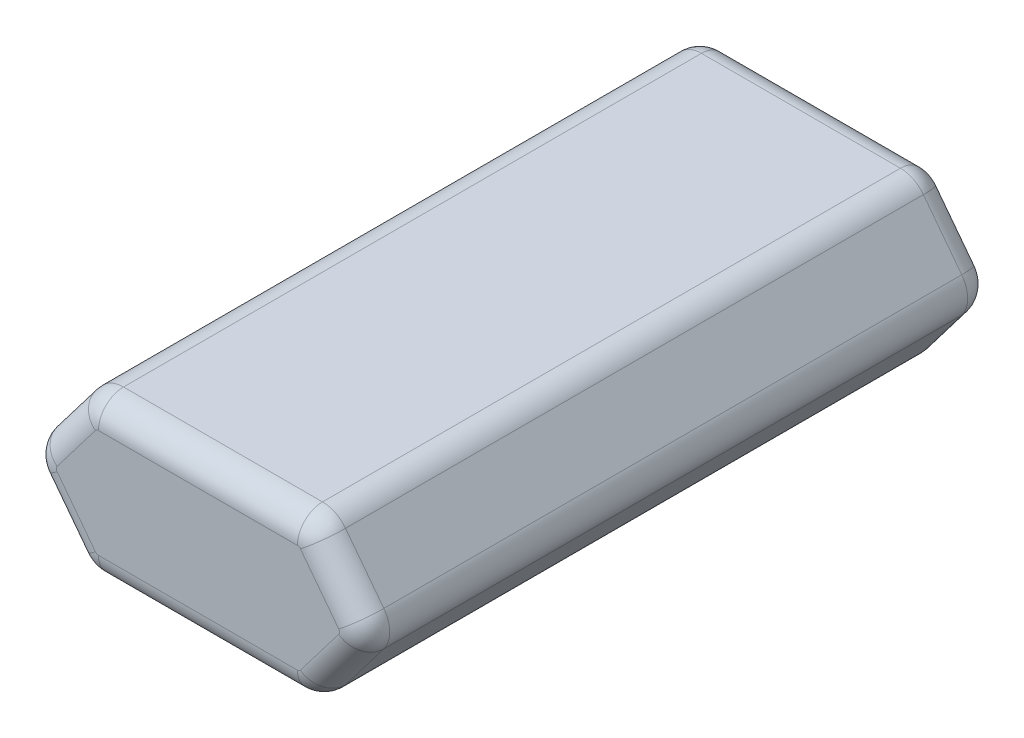
ISO-10303-21;
HEADER;
FILE_DESCRIPTION(('STEP AP214'),'2;1');
FILE_NAME('part.step','',(''),(''),'','','');
FILE_SCHEMA(('AUTOMOTIVE_DESIGN { 1 0 10303 214 1 1 1 1 }'));
ENDSEC;
DATA;
#1=APPLICATION_CONTEXT('core data for automotive mechanical design processes');
#2=APPLICATION_PROTOCOL_DEFINITION('international standard','automotive_design',2000,#1);
#3=PRODUCT_CONTEXT('',#1,'mechanical');
#4=PRODUCT('Part','Part','',(#3));
#5=PRODUCT_RELATED_PRODUCT_CATEGORY('part','',(#4));
#6=PRODUCT_DEFINITION_FORMATION('','',#4);
#7=PRODUCT_DEFINITION_CONTEXT('part definition',#1,'design');
#8=PRODUCT_DEFINITION('design','',#6,#7);
#9=PRODUCT_DEFINITION_SHAPE('','',#8);
#10=(LENGTH_UNIT() NAMED_UNIT(*) SI_UNIT(.MILLI.,.METRE.));
#11=(NAMED_UNIT(*) PLANE_ANGLE_UNIT() SI_UNIT($,.RADIAN.));
#12=(NAMED_UNIT(*) SI_UNIT($,.STERADIAN.) SOLID_ANGLE_UNIT());
#13=UNCERTAINTY_MEASURE_WITH_UNIT(LENGTH_MEASURE(1.E-05),#10,'distance_accuracy_value','');
#14=(GEOMETRIC_REPRESENTATION_CONTEXT(3) GLOBAL_UNCERTAINTY_ASSIGNED_CONTEXT((#13)) GLOBAL_UNIT_ASSIGNED_CONTEXT((#10,
#11,#12)) REPRESENTATION_CONTEXT('',''));
#15=CARTESIAN_POINT('',(0.,0.,0.));
#16=DIRECTION('',(0.,0.,1.));
#17=DIRECTION('',(1.,0.,0.));
#18=AXIS2_PLACEMENT_3D('',#15,#16,#17);
#19=CARTESIAN_POINT('',(16.0150795216056,7.5,-25.));
#20=DIRECTION('',(0.,0.,-1.));
#21=DIRECTION('',(-1.,0.,0.));
#22=AXIS2_PLACEMENT_3D('',#19,#20,#21);
#23=PLANE('',#22);
#24=CARTESIAN_POINT('',(17.5400795216056,5.5,-25.));
#25=DIRECTION('',(0.,0.,-1.));
#26=DIRECTION('',(-1.,0.,0.));
#27=AXIS2_PLACEMENT_3D('',#24,#25,#26);
#28=CIRCLE('',#27,0.15);
#29=CARTESIAN_POINT('',(17.5400795216056,5.35,-25.));
#30=VERTEX_POINT('',#29);
#31=CARTESIAN_POINT('',(17.4207989988934,5.40904860143191,-25.));
#32=VERTEX_POINT('',#31);
#33=EDGE_CURVE('E267',#30,#32,#28,.T.);
#34=ORIENTED_EDGE('',*,*,#33,.T.);
#35=DIRECTION('',(0.606342657120614,-0.795203484748346,0.));
#36=VECTOR('',#35,1.);
#37=CARTESIAN_POINT('',(15.8957989988934,7.40904860143191,-25.));
#38=LINE('',#37,#36);
#39=CARTESIAN_POINT('',(15.8957989988934,7.40904860143191,-25.));
#40=VERTEX_POINT('',#39);
#41=EDGE_CURVE('E269',#32,#40,#38,.F.);
#42=ORIENTED_EDGE('',*,*,#41,.T.);
#43=CARTESIAN_POINT('',(16.0150795216056,7.5,-25.));
#44=DIRECTION('',(0.,0.,-1.));
#45=DIRECTION('',(-1.,0.,0.));
#46=AXIS2_PLACEMENT_3D('',#43,#44,#45);
#47=CIRCLE('',#46,0.15);
#48=CARTESIAN_POINT('',(15.8957989988934,7.59095139856809,-25.));
#49=VERTEX_POINT('',#48);
#50=EDGE_CURVE('E233',#40,#49,#47,.T.);
#51=ORIENTED_EDGE('',*,*,#50,.T.);
#52=DIRECTION('',(-0.606342657120614,-0.795203484748346,0.));
#53=VECTOR('',#52,1.);
#54=CARTESIAN_POINT('',(15.8957989988934,7.59095139856809,-25.));
#55=LINE('',#54,#53);
#56=CARTESIAN_POINT('',(17.4207989988934,9.59095139856809,-25.));
#57=VERTEX_POINT('',#56);
#58=EDGE_CURVE('E244',#49,#57,#55,.F.);
#59=ORIENTED_EDGE('',*,*,#58,.T.);
#60=CARTESIAN_POINT('',(17.5400795216056,9.5,-25.));
#61=DIRECTION('',(0.,0.,-1.));
#62=DIRECTION('',(-1.,0.,0.));
#63=AXIS2_PLACEMENT_3D('',#60,#61,#62);
#64=CIRCLE('',#63,0.15);
#65=CARTESIAN_POINT('',(17.5400795216056,9.65,-25.));
#66=VERTEX_POINT('',#65);
#67=EDGE_CURVE('E251',#57,#66,#64,.T.);
#68=ORIENTED_EDGE('',*,*,#67,.T.);
#69=DIRECTION('',(-1.,0.,0.));
#70=VECTOR('',#69,1.);
#71=CARTESIAN_POINT('',(16.0150795216056,9.65,-25.));
#72=LINE('',#71,#70);
#73=CARTESIAN_POINT('',(25.4599204783944,9.65,-25.));
#74=VERTEX_POINT('',#73);
#75=EDGE_CURVE('E253',#66,#74,#72,.F.);
#76=ORIENTED_EDGE('',*,*,#75,.T.);
#77=CARTESIAN_POINT('',(25.4599204783944,9.5,-25.));
#78=DIRECTION('',(0.,0.,-1.));
#79=DIRECTION('',(-1.,0.,0.));
#80=AXIS2_PLACEMENT_3D('',#77,#78,#79);
#81=CIRCLE('',#80,0.15);
#82=CARTESIAN_POINT('',(25.5792010011066,9.59095139856809,-25.));
#83=VERTEX_POINT('',#82);
#84=EDGE_CURVE('E255',#74,#83,#81,.T.);
#85=ORIENTED_EDGE('',*,*,#84,.T.);
#86=DIRECTION('',(-0.606342657120614,0.795203484748346,0.));
#87=VECTOR('',#86,1.);
#88=CARTESIAN_POINT('',(23.0711234198191,12.8802334723878,-25.));
#89=LINE('',#88,#87);
#90=CARTESIAN_POINT('',(27.1042010011066,7.59095139856809,-25.));
#91=VERTEX_POINT('',#90);
#92=EDGE_CURVE('E257',#83,#91,#89,.F.);
#93=ORIENTED_EDGE('',*,*,#92,.T.);
#94=CARTESIAN_POINT('',(26.9849204783944,7.5,-25.));
#95=DIRECTION('',(0.,0.,-1.));
#96=DIRECTION('',(-1.,0.,0.));
#97=AXIS2_PLACEMENT_3D('',#94,#95,#96);
#98=CIRCLE('',#97,0.15);
#99=CARTESIAN_POINT('',(27.1042010011066,7.40904860143191,-25.));
#100=VERTEX_POINT('',#99);
#101=EDGE_CURVE('E259',#91,#100,#98,.T.);
#102=ORIENTED_EDGE('',*,*,#101,.T.);
#103=DIRECTION('',(0.606342657120614,0.795203484748346,0.));
#104=VECTOR('',#103,1.);
#105=CARTESIAN_POINT('',(23.0711234198191,2.11976652761222,-25.));
#106=LINE('',#105,#104);
#107=CARTESIAN_POINT('',(25.5792010011066,5.40904860143191,-25.));
#108=VERTEX_POINT('',#107);
#109=EDGE_CURVE('E261',#100,#108,#106,.F.);
#110=ORIENTED_EDGE('',*,*,#109,.T.);
#111=CARTESIAN_POINT('',(25.4599204783944,5.5,-25.));
#112=DIRECTION('',(0.,0.,-1.));
#113=DIRECTION('',(-1.,0.,0.));
#114=AXIS2_PLACEMENT_3D('',#111,#112,#113);
#115=CIRCLE('',#114,0.15);
#116=CARTESIAN_POINT('',(25.4599204783944,5.35,-25.));
#117=VERTEX_POINT('',#116);
#118=EDGE_CURVE('E263',#108,#117,#115,.T.);
#119=ORIENTED_EDGE('',*,*,#118,.T.);
#120=DIRECTION('',(1.,0.,0.));
#121=VECTOR('',#120,1.);
#122=CARTESIAN_POINT('',(16.0150795216056,5.35,-25.));
#123=LINE('',#122,#121);
#124=EDGE_CURVE('E265',#117,#30,#123,.F.);
#125=ORIENTED_EDGE('',*,*,#124,.T.);
#126=EDGE_LOOP('',(#34,#42,#51,#59,#68,#76,#85,#93,#102,#110,#119,#125));
#127=FACE_BOUND('',#126,.T.);
#128=ADVANCED_FACE('F43',(#127),#23,.T.);
#129=CARTESIAN_POINT('',(17.5400795216056,5.5,0.));
#130=DIRECTION('',(0.,0.,-1.));
#131=DIRECTION('',(-1.,0.,0.));
#132=AXIS2_PLACEMENT_3D('',#129,#130,#131);
#133=PLANE('',#132);
#134=CARTESIAN_POINT('',(16.0150795216056,7.5,0.));
#135=DIRECTION('',(0.,0.,-1.));
#136=DIRECTION('',(-1.,0.,0.));
#137=AXIS2_PLACEMENT_3D('',#134,#135,#136);
#138=CIRCLE('',#137,0.15);
#139=CARTESIAN_POINT('',(15.8957989988934,7.59095139856809,0.));
#140=VERTEX_POINT('',#139);
#141=CARTESIAN_POINT('',(15.8957989988934,7.40904860143191,0.));
#142=VERTEX_POINT('',#141);
#143=EDGE_CURVE('E52',#140,#142,#138,.F.);
#144=ORIENTED_EDGE('',*,*,#143,.T.);
#145=DIRECTION('',(0.606342657120614,-0.795203484748346,0.));
#146=VECTOR('',#145,1.);
#147=CARTESIAN_POINT('',(17.4207989988934,5.40904860143191,0.));
#148=LINE('',#147,#146);
#149=CARTESIAN_POINT('',(17.4207989988934,5.40904860143191,0.));
#150=VERTEX_POINT('',#149);
#151=EDGE_CURVE('E13',#142,#150,#148,.T.);
#152=ORIENTED_EDGE('',*,*,#151,.T.);
#153=CARTESIAN_POINT('',(17.5400795216056,5.5,0.));
#154=DIRECTION('',(0.,0.,-1.));
#155=DIRECTION('',(-1.,0.,0.));
#156=AXIS2_PLACEMENT_3D('',#153,#154,#155);
#157=CIRCLE('',#156,0.15);
#158=CARTESIAN_POINT('',(17.5400795216056,5.35,0.));
#159=VERTEX_POINT('',#158);
#160=EDGE_CURVE('E215',#150,#159,#157,.F.);
#161=ORIENTED_EDGE('',*,*,#160,.T.);
#162=DIRECTION('',(1.,0.,0.));
#163=VECTOR('',#162,1.);
#164=CARTESIAN_POINT('',(25.4599204783944,5.35,0.));
#165=LINE('',#164,#163);
#166=CARTESIAN_POINT('',(25.4599204783944,5.35,0.));
#167=VERTEX_POINT('',#166);
#168=EDGE_CURVE('E313',#159,#167,#165,.T.);
#169=ORIENTED_EDGE('',*,*,#168,.T.);
#170=CARTESIAN_POINT('',(25.4599204783944,5.5,0.));
#171=DIRECTION('',(0.,0.,-1.));
#172=DIRECTION('',(-1.,0.,0.));
#173=AXIS2_PLACEMENT_3D('',#170,#171,#172);
#174=CIRCLE('',#173,0.15);
#175=CARTESIAN_POINT('',(25.5792010011066,5.40904860143191,0.));
#176=VERTEX_POINT('',#175);
#177=EDGE_CURVE('E315',#167,#176,#174,.F.);
#178=ORIENTED_EDGE('',*,*,#177,.T.);
#179=DIRECTION('',(0.606342657120614,0.795203484748346,0.));
#180=VECTOR('',#179,1.);
#181=CARTESIAN_POINT('',(27.1042010011066,7.40904860143191,0.));
#182=LINE('',#181,#180);
#183=CARTESIAN_POINT('',(27.1042010011066,7.40904860143191,0.));
#184=VERTEX_POINT('',#183);
#185=EDGE_CURVE('E317',#176,#184,#182,.T.);
#186=ORIENTED_EDGE('',*,*,#185,.T.);
#187=CARTESIAN_POINT('',(26.9849204783944,7.5,0.));
#188=DIRECTION('',(0.,0.,-1.));
#189=DIRECTION('',(-1.,0.,0.));
#190=AXIS2_PLACEMENT_3D('',#187,#188,#189);
#191=CIRCLE('',#190,0.15);
#192=CARTESIAN_POINT('',(27.1042010011066,7.59095139856809,0.));
#193=VERTEX_POINT('',#192);
#194=EDGE_CURVE('E319',#184,#193,#191,.F.);
#195=ORIENTED_EDGE('',*,*,#194,.T.);
#196=DIRECTION('',(-0.606342657120614,0.795203484748346,0.));
#197=VECTOR('',#196,1.);
#198=CARTESIAN_POINT('',(25.5792010011066,9.59095139856809,0.));
#199=LINE('',#198,#197);
#200=CARTESIAN_POINT('',(25.5792010011066,9.59095139856809,0.));
#201=VERTEX_POINT('',#200);
#202=EDGE_CURVE('E321',#193,#201,#199,.T.);
#203=ORIENTED_EDGE('',*,*,#202,.T.);
#204=CARTESIAN_POINT('',(25.4599204783944,9.5,0.));
#205=DIRECTION('',(0.,0.,-1.));
#206=DIRECTION('',(-1.,0.,0.));
#207=AXIS2_PLACEMENT_3D('',#204,#205,#206);
#208=CIRCLE('',#207,0.15);
#209=CARTESIAN_POINT('',(25.4599204783944,9.65,0.));
#210=VERTEX_POINT('',#209);
#211=EDGE_CURVE('E323',#201,#210,#208,.F.);
#212=ORIENTED_EDGE('',*,*,#211,.T.);
#213=DIRECTION('',(-1.,0.,0.));
#214=VECTOR('',#213,1.);
#215=CARTESIAN_POINT('',(17.5400795216056,9.65,0.));
#216=LINE('',#215,#214);
#217=CARTESIAN_POINT('',(17.5400795216056,9.65,0.));
#218=VERTEX_POINT('',#217);
#219=EDGE_CURVE('E325',#210,#218,#216,.T.);
#220=ORIENTED_EDGE('',*,*,#219,.T.);
#221=CARTESIAN_POINT('',(17.5400795216056,9.5,0.));
#222=DIRECTION('',(0.,0.,-1.));
#223=DIRECTION('',(-1.,0.,0.));
#224=AXIS2_PLACEMENT_3D('',#221,#222,#223);
#225=CIRCLE('',#224,0.15);
#226=CARTESIAN_POINT('',(17.4207989988934,9.59095139856809,0.));
#227=VERTEX_POINT('',#226);
#228=EDGE_CURVE('E327',#218,#227,#225,.F.);
#229=ORIENTED_EDGE('',*,*,#228,.T.);
#230=DIRECTION('',(-0.606342657120614,-0.795203484748346,0.));
#231=VECTOR('',#230,1.);
#232=CARTESIAN_POINT('',(15.8957989988934,7.59095139856809,0.));
#233=LINE('',#232,#231);
#234=EDGE_CURVE('E63',#227,#140,#233,.T.);
#235=ORIENTED_EDGE('',*,*,#234,.T.);
#236=EDGE_LOOP('',(#144,#152,#161,#169,#178,#186,#195,#203,#212,#220,#229,#235));
#237=FACE_BOUND('',#236,.T.);
#238=ADVANCED_FACE('F535',(#237),#133,.F.);
#239=CARTESIAN_POINT('',(16.55,4.35,-25.));
#240=DIRECTION('',(0.,-1.,0.));
#241=DIRECTION('',(0.,0.,-1.));
#242=AXIS2_PLACEMENT_3D('',#239,#240,#241);
#243=PLANE('',#242);
#244=DIRECTION('',(0.,0.,-1.));
#245=VECTOR('',#244,1.);
#246=CARTESIAN_POINT('',(17.5400795216056,4.35,-25.));
#247=LINE('',#246,#245);
#248=CARTESIAN_POINT('',(17.5400795216056,4.35,-24.));
#249=VERTEX_POINT('',#248);
#250=CARTESIAN_POINT('',(17.5400795216056,4.35,-1.));
#251=VERTEX_POINT('',#250);
#252=EDGE_CURVE('E360',#249,#251,#247,.F.);
#253=ORIENTED_EDGE('',*,*,#252,.F.);
#254=DIRECTION('',(1.,0.,0.));
#255=VECTOR('',#254,1.);
#256=CARTESIAN_POINT('',(16.55,4.35,-24.));
#257=LINE('',#256,#255);
#258=CARTESIAN_POINT('',(25.4599204783944,4.35,-24.));
#259=VERTEX_POINT('',#258);
#260=EDGE_CURVE('E277',#249,#259,#257,.T.);
#261=ORIENTED_EDGE('',*,*,#260,.T.);
#262=DIRECTION('',(0.,0.,-1.));
#263=VECTOR('',#262,1.);
#264=CARTESIAN_POINT('',(25.4599204783944,4.35,-25.));
#265=LINE('',#264,#263);
#266=CARTESIAN_POINT('',(25.4599204783944,4.35,-1.));
#267=VERTEX_POINT('',#266);
#268=EDGE_CURVE('E433',#267,#259,#265,.T.);
#269=ORIENTED_EDGE('',*,*,#268,.F.);
#270=DIRECTION('',(1.,0.,0.));
#271=VECTOR('',#270,1.);
#272=CARTESIAN_POINT('',(17.5400795216056,4.35,-1.));
#273=LINE('',#272,#271);
#274=EDGE_CURVE('E275',#267,#251,#273,.F.);
#275=ORIENTED_EDGE('',*,*,#274,.T.);
#276=EDGE_LOOP('',(#253,#261,#269,#275));
#277=FACE_BOUND('',#276,.T.);
#278=ADVANCED_FACE('F464',(#277),#243,.T.);
#279=CARTESIAN_POINT('',(17.5400795216056,5.5,-25.));
#280=DIRECTION('',(0.,0.,-1.));
#281=DIRECTION('',(-1.,0.,0.));
#282=AXIS2_PLACEMENT_3D('',#279,#280,#281);
#283=CYLINDRICAL_SURFACE('',#282,1.15);
#284=DIRECTION('',(0.,0.,1.));
#285=VECTOR('',#284,1.);
#286=CARTESIAN_POINT('',(16.625595514145,4.8027059443113,-25.));
#287=LINE('',#286,#285);
#288=CARTESIAN_POINT('',(16.625595514145,4.8027059443113,-1.));
#289=VERTEX_POINT('',#288);
#290=CARTESIAN_POINT('',(16.625595514145,4.8027059443113,-24.));
#291=VERTEX_POINT('',#290);
#292=EDGE_CURVE('E228',#289,#291,#287,.F.);
#293=ORIENTED_EDGE('',*,*,#292,.T.);
#294=CARTESIAN_POINT('',(17.5400795216056,5.5,-24.));
#295=DIRECTION('',(0.,0.,-1.));
#296=DIRECTION('',(-1.,0.,0.));
#297=AXIS2_PLACEMENT_3D('',#294,#295,#296);
#298=CIRCLE('',#297,1.15);
#299=EDGE_CURVE('E273',#291,#249,#298,.F.);
#300=ORIENTED_EDGE('',*,*,#299,.T.);
#301=ORIENTED_EDGE('',*,*,#252,.T.);
#302=CARTESIAN_POINT('',(17.5400795216056,5.5,-1.));
#303=DIRECTION('',(0.,0.,-1.));
#304=DIRECTION('',(-1.,0.,0.));
#305=AXIS2_PLACEMENT_3D('',#302,#303,#304);
#306=CIRCLE('',#305,1.15);
#307=EDGE_CURVE('E271',#251,#289,#306,.T.);
#308=ORIENTED_EDGE('',*,*,#307,.T.);
#309=EDGE_LOOP('',(#293,#300,#301,#308));
#310=FACE_BOUND('',#309,.T.);
#311=ADVANCED_FACE('F467',(#310),#283,.T.);
#312=CARTESIAN_POINT('',(14.1759229620361,8.01539125855252,-25.));
#313=DIRECTION('',(-0.795203484748346,-0.606342657120614,0.));
#314=DIRECTION('',(0.606342657120614,-0.795203484748346,0.));
#315=AXIS2_PLACEMENT_3D('',#312,#313,#314);
#316=PLANE('',#315);
#317=DIRECTION('',(0.,0.,1.));
#318=VECTOR('',#317,1.);
#319=CARTESIAN_POINT('',(15.100595514145,6.80270594431129,-25.));
#320=LINE('',#319,#318);
#321=CARTESIAN_POINT('',(15.100595514145,6.80270594431129,-24.));
#322=VERTEX_POINT('',#321);
#323=CARTESIAN_POINT('',(15.100595514145,6.80270594431129,-1.));
#324=VERTEX_POINT('',#323);
#325=EDGE_CURVE('E208',#322,#324,#320,.T.);
#326=ORIENTED_EDGE('',*,*,#325,.F.);
#327=DIRECTION('',(0.606342657120614,-0.795203484748346,0.));
#328=VECTOR('',#327,1.);
#329=CARTESIAN_POINT('',(14.1759229620361,8.01539125855252,-24.));
#330=LINE('',#329,#328);
#331=EDGE_CURVE('E224',#322,#291,#330,.T.);
#332=ORIENTED_EDGE('',*,*,#331,.T.);
#333=ORIENTED_EDGE('',*,*,#292,.F.);
#334=DIRECTION('',(0.606342657120614,-0.795203484748346,0.));
#335=VECTOR('',#334,1.);
#336=CARTESIAN_POINT('',(15.100595514145,6.80270594431129,-1.));
#337=LINE('',#336,#335);
#338=EDGE_CURVE('E227',#289,#324,#337,.F.);
#339=ORIENTED_EDGE('',*,*,#338,.T.);
#340=EDGE_LOOP('',(#326,#332,#333,#339));
#341=FACE_BOUND('',#340,.T.);
#342=ADVANCED_FACE('F221',(#341),#316,.T.);
#343=CARTESIAN_POINT('',(16.0150795216056,7.5,-25.));
#344=DIRECTION('',(0.,0.,-1.));
#345=DIRECTION('',(-1.,0.,0.));
#346=AXIS2_PLACEMENT_3D('',#343,#344,#345);
#347=CYLINDRICAL_SURFACE('',#346,1.15);
#348=DIRECTION('',(0.,0.,1.));
#349=VECTOR('',#348,1.);
#350=CARTESIAN_POINT('',(15.100595514145,8.19729405568871,-25.));
#351=LINE('',#350,#349);
#352=CARTESIAN_POINT('',(15.100595514145,8.19729405568871,-1.));
#353=VERTEX_POINT('',#352);
#354=CARTESIAN_POINT('',(15.100595514145,8.19729405568871,-24.));
#355=VERTEX_POINT('',#354);
#356=EDGE_CURVE('E210',#353,#355,#351,.F.);
#357=ORIENTED_EDGE('',*,*,#356,.T.);
#358=CARTESIAN_POINT('',(16.0150795216056,7.5,-24.));
#359=DIRECTION('',(0.,0.,-1.));
#360=DIRECTION('',(-1.,0.,0.));
#361=AXIS2_PLACEMENT_3D('',#358,#359,#360);
#362=CIRCLE('',#361,1.15);
#363=EDGE_CURVE('E205',#355,#322,#362,.F.);
#364=ORIENTED_EDGE('',*,*,#363,.T.);
#365=ORIENTED_EDGE('',*,*,#325,.T.);
#366=CARTESIAN_POINT('',(16.0150795216056,7.5,-1.));
#367=DIRECTION('',(0.,0.,-1.));
#368=DIRECTION('',(-1.,0.,0.));
#369=AXIS2_PLACEMENT_3D('',#366,#367,#368);
#370=CIRCLE('',#369,1.15);
#371=EDGE_CURVE('E216',#324,#353,#370,.T.);
#372=ORIENTED_EDGE('',*,*,#371,.T.);
#373=EDGE_LOOP('',(#357,#364,#365,#372));
#374=FACE_BOUND('',#373,.T.);
#375=ADVANCED_FACE('F207',(#374),#347,.T.);
#376=CARTESIAN_POINT('',(14.1759229620361,6.98460874144748,-25.));
#377=DIRECTION('',(-0.795203484748346,0.606342657120614,0.));
#378=DIRECTION('',(-0.606342657120614,-0.795203484748346,0.));
#379=AXIS2_PLACEMENT_3D('',#376,#377,#378);
#380=PLANE('',#379);
#381=DIRECTION('',(0.,0.,1.));
#382=VECTOR('',#381,1.);
#383=CARTESIAN_POINT('',(16.625595514145,10.1972940556887,-25.));
#384=LINE('',#383,#382);
#385=CARTESIAN_POINT('',(16.625595514145,10.1972940556887,-24.));
#386=VERTEX_POINT('',#385);
#387=CARTESIAN_POINT('',(16.625595514145,10.1972940556887,-1.));
#388=VERTEX_POINT('',#387);
#389=EDGE_CURVE('E426',#386,#388,#384,.T.);
#390=ORIENTED_EDGE('',*,*,#389,.F.);
#391=DIRECTION('',(-0.606342657120614,-0.795203484748346,0.));
#392=VECTOR('',#391,1.);
#393=CARTESIAN_POINT('',(14.1759229620361,6.98460874144748,-24.));
#394=LINE('',#393,#392);
#395=EDGE_CURVE('E309',#386,#355,#394,.T.);
#396=ORIENTED_EDGE('',*,*,#395,.T.);
#397=ORIENTED_EDGE('',*,*,#356,.F.);
#398=DIRECTION('',(-0.606342657120614,-0.795203484748346,0.));
#399=VECTOR('',#398,1.);
#400=CARTESIAN_POINT('',(16.625595514145,10.1972940556887,-1.));
#401=LINE('',#400,#399);
#402=EDGE_CURVE('E307',#353,#388,#401,.F.);
#403=ORIENTED_EDGE('',*,*,#402,.T.);
#404=EDGE_LOOP('',(#390,#396,#397,#403));
#405=FACE_BOUND('',#404,.T.);
#406=ADVANCED_FACE('F522',(#405),#380,.T.);
#407=CARTESIAN_POINT('',(16.55,10.65,-25.));
#408=DIRECTION('',(0.,1.,0.));
#409=DIRECTION('',(0.,0.,1.));
#410=AXIS2_PLACEMENT_3D('',#407,#408,#409);
#411=PLANE('',#410);
#412=DIRECTION('',(0.,0.,1.));
#413=VECTOR('',#412,1.);
#414=CARTESIAN_POINT('',(25.4599204783944,10.65,-25.));
#415=LINE('',#414,#413);
#416=CARTESIAN_POINT('',(25.4599204783944,10.65,-24.));
#417=VERTEX_POINT('',#416);
#418=CARTESIAN_POINT('',(25.4599204783944,10.65,-1.));
#419=VERTEX_POINT('',#418);
#420=EDGE_CURVE('E423',#417,#419,#415,.T.);
#421=ORIENTED_EDGE('',*,*,#420,.F.);
#422=DIRECTION('',(-1.,0.,0.));
#423=VECTOR('',#422,1.);
#424=CARTESIAN_POINT('',(16.55,10.65,-24.));
#425=LINE('',#424,#423);
#426=CARTESIAN_POINT('',(17.5400795216056,10.65,-24.));
#427=VERTEX_POINT('',#426);
#428=EDGE_CURVE('E301',#417,#427,#425,.T.);
#429=ORIENTED_EDGE('',*,*,#428,.T.);
#430=DIRECTION('',(0.,0.,1.));
#431=VECTOR('',#430,1.);
#432=CARTESIAN_POINT('',(17.5400795216056,10.65,-25.));
#433=LINE('',#432,#431);
#434=CARTESIAN_POINT('',(17.5400795216056,10.65,-1.));
#435=VERTEX_POINT('',#434);
#436=EDGE_CURVE('E420',#435,#427,#433,.F.);
#437=ORIENTED_EDGE('',*,*,#436,.F.);
#438=DIRECTION('',(-1.,0.,0.));
#439=VECTOR('',#438,1.);
#440=CARTESIAN_POINT('',(25.4599204783944,10.65,-1.));
#441=LINE('',#440,#439);
#442=EDGE_CURVE('E299',#435,#419,#441,.F.);
#443=ORIENTED_EDGE('',*,*,#442,.T.);
#444=EDGE_LOOP('',(#421,#429,#437,#443));
#445=FACE_BOUND('',#444,.T.);
#446=ADVANCED_FACE('F500',(#445),#411,.T.);
#447=CARTESIAN_POINT('',(17.5400795216056,9.5,-25.));
#448=DIRECTION('',(0.,0.,-1.));
#449=DIRECTION('',(-1.,0.,0.));
#450=AXIS2_PLACEMENT_3D('',#447,#448,#449);
#451=CYLINDRICAL_SURFACE('',#450,1.15);
#452=ORIENTED_EDGE('',*,*,#436,.T.);
#453=CARTESIAN_POINT('',(17.5400795216056,9.5,-24.));
#454=DIRECTION('',(0.,0.,-1.));
#455=DIRECTION('',(-1.,0.,0.));
#456=AXIS2_PLACEMENT_3D('',#453,#454,#455);
#457=CIRCLE('',#456,1.15);
#458=EDGE_CURVE('E305',#427,#386,#457,.F.);
#459=ORIENTED_EDGE('',*,*,#458,.T.);
#460=ORIENTED_EDGE('',*,*,#389,.T.);
#461=CARTESIAN_POINT('',(17.5400795216056,9.5,-1.));
#462=DIRECTION('',(0.,0.,-1.));
#463=DIRECTION('',(-1.,0.,0.));
#464=AXIS2_PLACEMENT_3D('',#461,#462,#463);
#465=CIRCLE('',#464,1.15);
#466=EDGE_CURVE('E303',#388,#435,#465,.T.);
#467=ORIENTED_EDGE('',*,*,#466,.T.);
#468=EDGE_LOOP('',(#452,#459,#460,#467));
#469=FACE_BOUND('',#468,.T.);
#470=ADVANCED_FACE('F519',(#469),#451,.T.);
#471=CARTESIAN_POINT('',(25.4599204783944,9.5,-25.));
#472=DIRECTION('',(0.,0.,-1.));
#473=DIRECTION('',(-1.,0.,0.));
#474=AXIS2_PLACEMENT_3D('',#471,#472,#473);
#475=CYLINDRICAL_SURFACE('',#474,1.15);
#476=DIRECTION('',(0.,0.,1.));
#477=VECTOR('',#476,1.);
#478=CARTESIAN_POINT('',(26.374404485855,10.1972940556887,-25.));
#479=LINE('',#478,#477);
#480=CARTESIAN_POINT('',(26.374404485855,10.1972940556887,-1.));
#481=VERTEX_POINT('',#480);
#482=CARTESIAN_POINT('',(26.374404485855,10.1972940556887,-24.));
#483=VERTEX_POINT('',#482);
#484=EDGE_CURVE('E412',#481,#483,#479,.F.);
#485=ORIENTED_EDGE('',*,*,#484,.T.);
#486=CARTESIAN_POINT('',(25.4599204783944,9.5,-24.));
#487=DIRECTION('',(0.,0.,-1.));
#488=DIRECTION('',(-1.,0.,0.));
#489=AXIS2_PLACEMENT_3D('',#486,#487,#488);
#490=CIRCLE('',#489,1.15);
#491=EDGE_CURVE('E297',#483,#417,#490,.F.);
#492=ORIENTED_EDGE('',*,*,#491,.T.);
#493=ORIENTED_EDGE('',*,*,#420,.T.);
#494=CARTESIAN_POINT('',(25.4599204783944,9.5,-1.));
#495=DIRECTION('',(0.,0.,-1.));
#496=DIRECTION('',(-1.,0.,0.));
#497=AXIS2_PLACEMENT_3D('',#494,#495,#496);
#498=CIRCLE('',#497,1.15);
#499=EDGE_CURVE('E295',#419,#481,#498,.T.);
#500=ORIENTED_EDGE('',*,*,#499,.T.);
#501=EDGE_LOOP('',(#485,#492,#493,#500));
#502=FACE_BOUND('',#501,.T.);
#503=ADVANCED_FACE('F496',(#502),#475,.T.);
#504=CARTESIAN_POINT('',(28.8240770379639,6.98460874144748,-25.));
#505=DIRECTION('',(0.795203484748346,0.606342657120614,0.));
#506=DIRECTION('',(-0.606342657120614,0.795203484748346,0.));
#507=AXIS2_PLACEMENT_3D('',#504,#505,#506);
#508=PLANE('',#507);
#509=DIRECTION('',(0.,0.,1.));
#510=VECTOR('',#509,1.);
#511=CARTESIAN_POINT('',(27.899404485855,8.19729405568871,-25.));
#512=LINE('',#511,#510);
#513=CARTESIAN_POINT('',(27.899404485855,8.19729405568871,-24.));
#514=VERTEX_POINT('',#513);
#515=CARTESIAN_POINT('',(27.899404485855,8.19729405568871,-1.));
#516=VERTEX_POINT('',#515);
#517=EDGE_CURVE('E409',#514,#516,#512,.T.);
#518=ORIENTED_EDGE('',*,*,#517,.F.);
#519=DIRECTION('',(-0.606342657120614,0.795203484748346,0.));
#520=VECTOR('',#519,1.);
#521=CARTESIAN_POINT('',(28.8240770379639,6.98460874144748,-24.));
#522=LINE('',#521,#520);
#523=EDGE_CURVE('E293',#514,#483,#522,.T.);
#524=ORIENTED_EDGE('',*,*,#523,.T.);
#525=ORIENTED_EDGE('',*,*,#484,.F.);
#526=DIRECTION('',(-0.606342657120614,0.795203484748346,0.));
#527=VECTOR('',#526,1.);
#528=CARTESIAN_POINT('',(27.899404485855,8.19729405568871,-1.));
#529=LINE('',#528,#527);
#530=EDGE_CURVE('E291',#481,#516,#529,.F.);
#531=ORIENTED_EDGE('',*,*,#530,.T.);
#532=EDGE_LOOP('',(#518,#524,#525,#531));
#533=FACE_BOUND('',#532,.T.);
#534=ADVANCED_FACE('F408',(#533),#508,.T.);
#535=CARTESIAN_POINT('',(26.9849204783944,7.5,-25.));
#536=DIRECTION('',(0.,0.,-1.));
#537=DIRECTION('',(-1.,0.,0.));
#538=AXIS2_PLACEMENT_3D('',#535,#536,#537);
#539=CYLINDRICAL_SURFACE('',#538,1.15);
#540=DIRECTION('',(0.,0.,1.));
#541=VECTOR('',#540,1.);
#542=CARTESIAN_POINT('',(27.899404485855,6.80270594431129,-25.));
#543=LINE('',#542,#541);
#544=CARTESIAN_POINT('',(27.899404485855,6.80270594431129,-1.));
#545=VERTEX_POINT('',#544);
#546=CARTESIAN_POINT('',(27.899404485855,6.80270594431129,-24.));
#547=VERTEX_POINT('',#546);
#548=EDGE_CURVE('E418',#545,#547,#543,.F.);
#549=ORIENTED_EDGE('',*,*,#548,.T.);
#550=CARTESIAN_POINT('',(26.9849204783944,7.5,-24.));
#551=DIRECTION('',(0.,0.,-1.));
#552=DIRECTION('',(-1.,0.,0.));
#553=AXIS2_PLACEMENT_3D('',#550,#551,#552);
#554=CIRCLE('',#553,1.15);
#555=EDGE_CURVE('E289',#547,#514,#554,.F.);
#556=ORIENTED_EDGE('',*,*,#555,.T.);
#557=ORIENTED_EDGE('',*,*,#517,.T.);
#558=CARTESIAN_POINT('',(26.9849204783944,7.5,-1.));
#559=DIRECTION('',(0.,0.,-1.));
#560=DIRECTION('',(-1.,0.,0.));
#561=AXIS2_PLACEMENT_3D('',#558,#559,#560);
#562=CIRCLE('',#561,1.15);
#563=EDGE_CURVE('E287',#516,#545,#562,.T.);
#564=ORIENTED_EDGE('',*,*,#563,.T.);
#565=EDGE_LOOP('',(#549,#556,#557,#564));
#566=FACE_BOUND('',#565,.T.);
#567=ADVANCED_FACE('F415',(#566),#539,.T.);
#568=CARTESIAN_POINT('',(25.4599204783944,5.5,-25.));
#569=DIRECTION('',(0.,0.,-1.));
#570=DIRECTION('',(-1.,0.,0.));
#571=AXIS2_PLACEMENT_3D('',#568,#569,#570);
#572=CYLINDRICAL_SURFACE('',#571,1.15);
#573=ORIENTED_EDGE('',*,*,#268,.T.);
#574=CARTESIAN_POINT('',(25.4599204783944,5.5,-24.));
#575=DIRECTION('',(0.,0.,-1.));
#576=DIRECTION('',(-1.,0.,0.));
#577=AXIS2_PLACEMENT_3D('',#574,#575,#576);
#578=CIRCLE('',#577,1.15);
#579=CARTESIAN_POINT('',(26.374404485855,4.8027059443113,-24.));
#580=VERTEX_POINT('',#579);
#581=EDGE_CURVE('E281',#259,#580,#578,.F.);
#582=ORIENTED_EDGE('',*,*,#581,.T.);
#583=DIRECTION('',(0.,0.,1.));
#584=VECTOR('',#583,1.);
#585=CARTESIAN_POINT('',(26.374404485855,4.8027059443113,-25.));
#586=LINE('',#585,#584);
#587=CARTESIAN_POINT('',(26.374404485855,4.8027059443113,-1.));
#588=VERTEX_POINT('',#587);
#589=EDGE_CURVE('E246',#580,#588,#586,.T.);
#590=ORIENTED_EDGE('',*,*,#589,.T.);
#591=CARTESIAN_POINT('',(25.4599204783944,5.5,-1.));
#592=DIRECTION('',(0.,0.,-1.));
#593=DIRECTION('',(-1.,0.,0.));
#594=AXIS2_PLACEMENT_3D('',#591,#592,#593);
#595=CIRCLE('',#594,1.15);
#596=EDGE_CURVE('E279',#588,#267,#595,.T.);
#597=ORIENTED_EDGE('',*,*,#596,.T.);
#598=EDGE_LOOP('',(#573,#582,#590,#597));
#599=FACE_BOUND('',#598,.T.);
#600=ADVANCED_FACE('F442',(#599),#572,.T.);
#601=CARTESIAN_POINT('',(28.8240770379639,8.01539125855252,-25.));
#602=DIRECTION('',(0.795203484748346,-0.606342657120614,0.));
#603=DIRECTION('',(0.606342657120614,0.795203484748346,0.));
#604=AXIS2_PLACEMENT_3D('',#601,#602,#603);
#605=PLANE('',#604);
#606=ORIENTED_EDGE('',*,*,#589,.F.);
#607=DIRECTION('',(0.606342657120614,0.795203484748346,0.));
#608=VECTOR('',#607,1.);
#609=CARTESIAN_POINT('',(28.8240770379639,8.01539125855252,-24.));
#610=LINE('',#609,#608);
#611=EDGE_CURVE('E285',#580,#547,#610,.T.);
#612=ORIENTED_EDGE('',*,*,#611,.T.);
#613=ORIENTED_EDGE('',*,*,#548,.F.);
#614=DIRECTION('',(0.606342657120614,0.795203484748346,0.));
#615=VECTOR('',#614,1.);
#616=CARTESIAN_POINT('',(26.374404485855,4.8027059443113,-1.));
#617=LINE('',#616,#615);
#618=EDGE_CURVE('E283',#545,#588,#617,.F.);
#619=ORIENTED_EDGE('',*,*,#618,.T.);
#620=EDGE_LOOP('',(#606,#612,#613,#619));
#621=FACE_BOUND('',#620,.T.);
#622=ADVANCED_FACE('F484',(#621),#605,.T.);
#623=CARTESIAN_POINT('',(28.0288735532156,6.37826608432686,-24.));
#624=DIRECTION('',(-0.606342657120614,0.795203484748346,0.));
#625=DIRECTION('',(-0.795203484748346,-0.606342657120614,0.));
#626=AXIS2_PLACEMENT_3D('',#623,#624,#625);
#627=CYLINDRICAL_SURFACE('',#626,1.);
#628=CARTESIAN_POINT('',(27.1042010011066,7.59095139856809,-24.));
#629=DIRECTION('',(0.606342657120614,-0.795203484748347,0.));
#630=DIRECTION('',(0.795203484748347,0.606342657120614,0.));
#631=AXIS2_PLACEMENT_3D('',#628,#629,#630);
#632=CIRCLE('',#631,1.);
#633=EDGE_CURVE('E354',#91,#514,#632,.T.);
#634=ORIENTED_EDGE('',*,*,#633,.F.);
#635=ORIENTED_EDGE('',*,*,#92,.F.);
#636=CARTESIAN_POINT('',(25.5792010011066,9.59095139856809,-24.));
#637=DIRECTION('',(-0.606342657120614,0.795203484748347,0.));
#638=DIRECTION('',(-0.795203484748347,-0.606342657120614,0.));
#639=AXIS2_PLACEMENT_3D('',#636,#637,#638);
#640=CIRCLE('',#639,1.);
#641=EDGE_CURVE('E357',#483,#83,#640,.T.);
#642=ORIENTED_EDGE('',*,*,#641,.F.);
#643=ORIENTED_EDGE('',*,*,#523,.F.);
#644=EDGE_LOOP('',(#634,#635,#642,#643));
#645=FACE_BOUND('',#644,.T.);
#646=ADVANCED_FACE('F492',(#645),#627,.T.);
#647=CARTESIAN_POINT('',(25.4599204783944,9.5,-24.));
#648=DIRECTION('',(0.,0.,-1.));
#649=DIRECTION('',(-1.,0.,0.));
#650=AXIS2_PLACEMENT_3D('',#647,#648,#649);
#651=DEGENERATE_TOROIDAL_SURFACE('',#650,0.15,1.,.T.);
#652=ORIENTED_EDGE('',*,*,#641,.T.);
#653=ORIENTED_EDGE('',*,*,#84,.F.);
#654=CARTESIAN_POINT('',(25.4599204783944,9.65,-24.));
#655=DIRECTION('',(-1.,0.,0.));
#656=DIRECTION('',(0.,0.,1.));
#657=AXIS2_PLACEMENT_3D('',#654,#655,#656);
#658=CIRCLE('',#657,1.);
#659=EDGE_CURVE('E351',#417,#74,#658,.T.);
#660=ORIENTED_EDGE('',*,*,#659,.F.);
#661=ORIENTED_EDGE('',*,*,#491,.F.);
#662=EDGE_LOOP('',(#652,#653,#660,#661));
#663=FACE_BOUND('',#662,.T.);
#664=ADVANCED_FACE('F506',(#663),#651,.T.);
#665=CARTESIAN_POINT('',(26.9849204783944,7.5,-24.));
#666=DIRECTION('',(0.,0.,-1.));
#667=DIRECTION('',(-1.,0.,0.));
#668=AXIS2_PLACEMENT_3D('',#665,#666,#667);
#669=DEGENERATE_TOROIDAL_SURFACE('',#668,0.15,1.,.T.);
#670=ORIENTED_EDGE('',*,*,#633,.T.);
#671=ORIENTED_EDGE('',*,*,#555,.F.);
#672=CARTESIAN_POINT('',(27.1042010011066,7.40904860143191,-24.));
#673=DIRECTION('',(-0.606342657120614,-0.795203484748347,0.));
#674=DIRECTION('',(0.795203484748347,-0.606342657120614,0.));
#675=AXIS2_PLACEMENT_3D('',#672,#673,#674);
#676=CIRCLE('',#675,1.);
#677=EDGE_CURVE('E348',#100,#547,#676,.T.);
#678=ORIENTED_EDGE('',*,*,#677,.F.);
#679=ORIENTED_EDGE('',*,*,#101,.F.);
#680=EDGE_LOOP('',(#670,#671,#678,#679));
#681=FACE_BOUND('',#680,.T.);
#682=ADVANCED_FACE('F487',(#681),#669,.T.);
#683=CARTESIAN_POINT('',(16.55,9.65,-24.));
#684=DIRECTION('',(-1.,0.,0.));
#685=DIRECTION('',(0.,0.,1.));
#686=AXIS2_PLACEMENT_3D('',#683,#684,#685);
#687=CYLINDRICAL_SURFACE('',#686,1.);
#688=ORIENTED_EDGE('',*,*,#659,.T.);
#689=ORIENTED_EDGE('',*,*,#75,.F.);
#690=CARTESIAN_POINT('',(17.5400795216056,9.65,-24.));
#691=DIRECTION('',(-1.,0.,0.));
#692=DIRECTION('',(0.,0.,1.));
#693=AXIS2_PLACEMENT_3D('',#690,#691,#692);
#694=CIRCLE('',#693,1.);
#695=EDGE_CURVE('E345',#427,#66,#694,.T.);
#696=ORIENTED_EDGE('',*,*,#695,.F.);
#697=ORIENTED_EDGE('',*,*,#428,.F.);
#698=EDGE_LOOP('',(#688,#689,#696,#697));
#699=FACE_BOUND('',#698,.T.);
#700=ADVANCED_FACE('F510',(#699),#687,.T.);
#701=CARTESIAN_POINT('',(28.0288735532156,8.62173391567314,-24.));
#702=DIRECTION('',(0.606342657120614,0.795203484748346,0.));
#703=DIRECTION('',(-0.795203484748346,0.606342657120614,0.));
#704=AXIS2_PLACEMENT_3D('',#701,#702,#703);
#705=CYLINDRICAL_SURFACE('',#704,1.);
#706=ORIENTED_EDGE('',*,*,#677,.T.);
#707=ORIENTED_EDGE('',*,*,#611,.F.);
#708=CARTESIAN_POINT('',(25.5792010011066,5.40904860143191,-24.));
#709=DIRECTION('',(-0.606342657120614,-0.795203484748347,0.));
#710=DIRECTION('',(0.795203484748347,-0.606342657120614,0.));
#711=AXIS2_PLACEMENT_3D('',#708,#709,#710);
#712=CIRCLE('',#711,1.);
#713=EDGE_CURVE('E342',#108,#580,#712,.T.);
#714=ORIENTED_EDGE('',*,*,#713,.F.);
#715=ORIENTED_EDGE('',*,*,#109,.F.);
#716=EDGE_LOOP('',(#706,#707,#714,#715));
#717=FACE_BOUND('',#716,.T.);
#718=ADVANCED_FACE('F482',(#717),#705,.T.);
#719=CARTESIAN_POINT('',(17.5400795216056,9.5,-24.));
#720=DIRECTION('',(0.,0.,-1.));
#721=DIRECTION('',(-1.,0.,0.));
#722=AXIS2_PLACEMENT_3D('',#719,#720,#721);
#723=DEGENERATE_TOROIDAL_SURFACE('',#722,0.15,1.,.T.);
#724=ORIENTED_EDGE('',*,*,#695,.T.);
#725=ORIENTED_EDGE('',*,*,#67,.F.);
#726=CARTESIAN_POINT('',(17.4207989988934,9.59095139856809,-24.));
#727=DIRECTION('',(-0.606342657120613,-0.795203484748347,0.));
#728=DIRECTION('',(0.795203484748347,-0.606342657120613,0.));
#729=AXIS2_PLACEMENT_3D('',#726,#727,#728);
#730=CIRCLE('',#729,1.);
#731=EDGE_CURVE('E339',#386,#57,#730,.T.);
#732=ORIENTED_EDGE('',*,*,#731,.F.);
#733=ORIENTED_EDGE('',*,*,#458,.F.);
#734=EDGE_LOOP('',(#724,#725,#732,#733));
#735=FACE_BOUND('',#734,.T.);
#736=ADVANCED_FACE('F515',(#735),#723,.T.);
#737=CARTESIAN_POINT('',(25.4599204783944,5.5,-24.));
#738=DIRECTION('',(0.,0.,-1.));
#739=DIRECTION('',(-1.,0.,0.));
#740=AXIS2_PLACEMENT_3D('',#737,#738,#739);
#741=DEGENERATE_TOROIDAL_SURFACE('',#740,0.15,1.,.T.);
#742=ORIENTED_EDGE('',*,*,#713,.T.);
#743=ORIENTED_EDGE('',*,*,#581,.F.);
#744=CARTESIAN_POINT('',(25.4599204783944,5.35,-24.));
#745=DIRECTION('',(-1.,0.,0.));
#746=DIRECTION('',(0.,0.,1.));
#747=AXIS2_PLACEMENT_3D('',#744,#745,#746);
#748=CIRCLE('',#747,1.);
#749=EDGE_CURVE('E336',#117,#259,#748,.T.);
#750=ORIENTED_EDGE('',*,*,#749,.F.);
#751=ORIENTED_EDGE('',*,*,#118,.F.);
#752=EDGE_LOOP('',(#742,#743,#750,#751));
#753=FACE_BOUND('',#752,.T.);
#754=ADVANCED_FACE('F477',(#753),#741,.T.);
#755=CARTESIAN_POINT('',(14.9711264467844,6.37826608432686,-24.));
#756=DIRECTION('',(-0.606342657120614,-0.795203484748346,0.));
#757=DIRECTION('',(0.795203484748346,-0.606342657120614,0.));
#758=AXIS2_PLACEMENT_3D('',#755,#756,#757);
#759=CYLINDRICAL_SURFACE('',#758,1.);
#760=ORIENTED_EDGE('',*,*,#731,.T.);
#761=ORIENTED_EDGE('',*,*,#58,.F.);
#762=CARTESIAN_POINT('',(15.8957989988934,7.59095139856809,-24.));
#763=DIRECTION('',(-0.606342657120615,-0.795203484748346,0.));
#764=DIRECTION('',(0.795203484748346,-0.606342657120615,0.));
#765=AXIS2_PLACEMENT_3D('',#762,#763,#764);
#766=CIRCLE('',#765,1.);
#767=EDGE_CURVE('E334',#355,#49,#766,.T.);
#768=ORIENTED_EDGE('',*,*,#767,.F.);
#769=ORIENTED_EDGE('',*,*,#395,.F.);
#770=EDGE_LOOP('',(#760,#761,#768,#769));
#771=FACE_BOUND('',#770,.T.);
#772=ADVANCED_FACE('F588',(#771),#759,.T.);
#773=CARTESIAN_POINT('',(16.55,5.35,-24.));
#774=DIRECTION('',(1.,0.,0.));
#775=DIRECTION('',(0.,0.,-1.));
#776=AXIS2_PLACEMENT_3D('',#773,#774,#775);
#777=CYLINDRICAL_SURFACE('',#776,1.);
#778=ORIENTED_EDGE('',*,*,#749,.T.);
#779=ORIENTED_EDGE('',*,*,#260,.F.);
#780=CARTESIAN_POINT('',(17.5400795216056,5.35,-24.));
#781=DIRECTION('',(-1.,0.,0.));
#782=DIRECTION('',(0.,0.,1.));
#783=AXIS2_PLACEMENT_3D('',#780,#781,#782);
#784=CIRCLE('',#783,1.);
#785=EDGE_CURVE('E237',#30,#249,#784,.T.);
#786=ORIENTED_EDGE('',*,*,#785,.F.);
#787=ORIENTED_EDGE('',*,*,#124,.F.);
#788=EDGE_LOOP('',(#778,#779,#786,#787));
#789=FACE_BOUND('',#788,.T.);
#790=ADVANCED_FACE('F474',(#789),#777,.T.);
#791=CARTESIAN_POINT('',(16.0150795216056,7.5,-24.));
#792=DIRECTION('',(0.,0.,-1.));
#793=DIRECTION('',(-1.,0.,0.));
#794=AXIS2_PLACEMENT_3D('',#791,#792,#793);
#795=DEGENERATE_TOROIDAL_SURFACE('',#794,0.15,1.,.T.);
#796=ORIENTED_EDGE('',*,*,#767,.T.);
#797=ORIENTED_EDGE('',*,*,#50,.F.);
#798=CARTESIAN_POINT('',(15.8957989988934,7.40904860143191,-24.));
#799=DIRECTION('',(0.606342657120613,-0.795203484748347,0.));
#800=DIRECTION('',(0.795203484748347,0.606342657120613,0.));
#801=AXIS2_PLACEMENT_3D('',#798,#799,#800);
#802=CIRCLE('',#801,1.);
#803=EDGE_CURVE('E231',#322,#40,#802,.T.);
#804=ORIENTED_EDGE('',*,*,#803,.F.);
#805=ORIENTED_EDGE('',*,*,#363,.F.);
#806=EDGE_LOOP('',(#796,#797,#804,#805));
#807=FACE_BOUND('',#806,.T.);
#808=ADVANCED_FACE('F232',(#807),#795,.T.);
#809=CARTESIAN_POINT('',(17.5400795216056,5.5,-24.));
#810=DIRECTION('',(0.,0.,-1.));
#811=DIRECTION('',(-1.,0.,0.));
#812=AXIS2_PLACEMENT_3D('',#809,#810,#811);
#813=DEGENERATE_TOROIDAL_SURFACE('',#812,0.15,1.,.T.);
#814=ORIENTED_EDGE('',*,*,#785,.T.);
#815=ORIENTED_EDGE('',*,*,#299,.F.);
#816=CARTESIAN_POINT('',(17.4207989988934,5.40904860143191,-24.));
#817=DIRECTION('',(-0.606342657120613,0.795203484748347,0.));
#818=DIRECTION('',(-0.795203484748347,-0.606342657120613,0.));
#819=AXIS2_PLACEMENT_3D('',#816,#817,#818);
#820=CIRCLE('',#819,1.);
#821=EDGE_CURVE('E238',#32,#291,#820,.T.);
#822=ORIENTED_EDGE('',*,*,#821,.F.);
#823=ORIENTED_EDGE('',*,*,#33,.F.);
#824=EDGE_LOOP('',(#814,#815,#822,#823));
#825=FACE_BOUND('',#824,.T.);
#826=ADVANCED_FACE('F469',(#825),#813,.T.);
#827=CARTESIAN_POINT('',(14.9711264467844,8.62173391567314,-24.));
#828=DIRECTION('',(0.606342657120614,-0.795203484748346,0.));
#829=DIRECTION('',(0.795203484748346,0.606342657120614,0.));
#830=AXIS2_PLACEMENT_3D('',#827,#828,#829);
#831=CYLINDRICAL_SURFACE('',#830,1.);
#832=ORIENTED_EDGE('',*,*,#803,.T.);
#833=ORIENTED_EDGE('',*,*,#41,.F.);
#834=ORIENTED_EDGE('',*,*,#821,.T.);
#835=ORIENTED_EDGE('',*,*,#331,.F.);
#836=EDGE_LOOP('',(#832,#833,#834,#835));
#837=FACE_BOUND('',#836,.T.);
#838=ADVANCED_FACE('F240',(#837),#831,.T.);
#839=CARTESIAN_POINT('',(24.5961234198191,10.8802334723878,-1.));
#840=DIRECTION('',(0.606342657120614,-0.795203484748346,0.));
#841=DIRECTION('',(0.795203484748346,0.606342657120614,0.));
#842=AXIS2_PLACEMENT_3D('',#839,#840,#841);
#843=CYLINDRICAL_SURFACE('',#842,1.);
#844=CARTESIAN_POINT('',(27.1042010011066,7.59095139856809,-1.));
#845=DIRECTION('',(0.606342657120614,-0.795203484748346,0.));
#846=DIRECTION('',(0.795203484748346,0.606342657120614,0.));
#847=AXIS2_PLACEMENT_3D('',#844,#845,#846);
#848=CIRCLE('',#847,1.);
#849=EDGE_CURVE('E388',#516,#193,#848,.T.);
#850=ORIENTED_EDGE('',*,*,#849,.F.);
#851=ORIENTED_EDGE('',*,*,#530,.F.);
#852=CARTESIAN_POINT('',(25.5792010011066,9.59095139856809,-1.));
#853=DIRECTION('',(-0.606342657120614,0.795203484748346,0.));
#854=DIRECTION('',(-0.795203484748346,-0.606342657120614,0.));
#855=AXIS2_PLACEMENT_3D('',#852,#853,#854);
#856=CIRCLE('',#855,1.);
#857=EDGE_CURVE('E47',#201,#481,#856,.T.);
#858=ORIENTED_EDGE('',*,*,#857,.F.);
#859=ORIENTED_EDGE('',*,*,#202,.F.);
#860=EDGE_LOOP('',(#850,#851,#858,#859));
#861=FACE_BOUND('',#860,.T.);
#862=ADVANCED_FACE('F45',(#861),#843,.T.);
#863=CARTESIAN_POINT('',(25.4599204783944,9.5,-1.));
#864=DIRECTION('',(0.,0.,-1.));
#865=DIRECTION('',(-1.,0.,0.));
#866=AXIS2_PLACEMENT_3D('',#863,#864,#865);
#867=DEGENERATE_TOROIDAL_SURFACE('',#866,0.15,1.,.T.);
#868=ORIENTED_EDGE('',*,*,#857,.T.);
#869=ORIENTED_EDGE('',*,*,#499,.F.);
#870=CARTESIAN_POINT('',(25.4599204783944,9.65,-1.));
#871=DIRECTION('',(-1.,0.,0.));
#872=DIRECTION('',(0.,0.,1.));
#873=AXIS2_PLACEMENT_3D('',#870,#871,#872);
#874=CIRCLE('',#873,1.);
#875=EDGE_CURVE('E386',#210,#419,#874,.T.);
#876=ORIENTED_EDGE('',*,*,#875,.F.);
#877=ORIENTED_EDGE('',*,*,#211,.F.);
#878=EDGE_LOOP('',(#868,#869,#876,#877));
#879=FACE_BOUND('',#878,.T.);
#880=ADVANCED_FACE('F399',(#879),#867,.T.);
#881=CARTESIAN_POINT('',(26.9849204783944,7.5,-1.));
#882=DIRECTION('',(0.,0.,-1.));
#883=DIRECTION('',(-1.,0.,0.));
#884=AXIS2_PLACEMENT_3D('',#881,#882,#883);
#885=DEGENERATE_TOROIDAL_SURFACE('',#884,0.15,1.,.T.);
#886=ORIENTED_EDGE('',*,*,#849,.T.);
#887=ORIENTED_EDGE('',*,*,#194,.F.);
#888=CARTESIAN_POINT('',(27.1042010011066,7.40904860143191,-1.));
#889=DIRECTION('',(-0.606342657120614,-0.795203484748347,0.));
#890=DIRECTION('',(0.795203484748347,-0.606342657120614,0.));
#891=AXIS2_PLACEMENT_3D('',#888,#889,#890);
#892=CIRCLE('',#891,1.);
#893=EDGE_CURVE('E383',#545,#184,#892,.T.);
#894=ORIENTED_EDGE('',*,*,#893,.F.);
#895=ORIENTED_EDGE('',*,*,#563,.F.);
#896=EDGE_LOOP('',(#886,#887,#894,#895));
#897=FACE_BOUND('',#896,.T.);
#898=ADVANCED_FACE('F670',(#897),#885,.T.);
#899=CARTESIAN_POINT('',(17.5400795216056,9.65,-1.));
#900=DIRECTION('',(1.,0.,0.));
#901=DIRECTION('',(0.,0.,-1.));
#902=AXIS2_PLACEMENT_3D('',#899,#900,#901);
#903=CYLINDRICAL_SURFACE('',#902,1.);
#904=ORIENTED_EDGE('',*,*,#875,.T.);
#905=ORIENTED_EDGE('',*,*,#442,.F.);
#906=CARTESIAN_POINT('',(17.5400795216056,9.65,-1.));
#907=DIRECTION('',(-1.,0.,0.));
#908=DIRECTION('',(0.,0.,1.));
#909=AXIS2_PLACEMENT_3D('',#906,#907,#908);
#910=CIRCLE('',#909,1.);
#911=EDGE_CURVE('E380',#218,#435,#910,.T.);
#912=ORIENTED_EDGE('',*,*,#911,.F.);
#913=ORIENTED_EDGE('',*,*,#219,.F.);
#914=EDGE_LOOP('',(#904,#905,#912,#913));
#915=FACE_BOUND('',#914,.T.);
#916=ADVANCED_FACE('F677',(#915),#903,.T.);
#917=CARTESIAN_POINT('',(22.6674602442436,1.59037219898857,-1.));
#918=DIRECTION('',(-0.606342657120614,-0.795203484748346,0.));
#919=DIRECTION('',(0.795203484748346,-0.606342657120614,0.));
#920=AXIS2_PLACEMENT_3D('',#917,#918,#919);
#921=CYLINDRICAL_SURFACE('',#920,1.);
#922=ORIENTED_EDGE('',*,*,#893,.T.);
#923=ORIENTED_EDGE('',*,*,#185,.F.);
#924=CARTESIAN_POINT('',(25.5792010011066,5.40904860143191,-1.));
#925=DIRECTION('',(-0.606342657120614,-0.795203484748346,0.));
#926=DIRECTION('',(0.795203484748346,-0.606342657120614,0.));
#927=AXIS2_PLACEMENT_3D('',#924,#925,#926);
#928=CIRCLE('',#927,1.);
#929=EDGE_CURVE('E377',#588,#176,#928,.T.);
#930=ORIENTED_EDGE('',*,*,#929,.F.);
#931=ORIENTED_EDGE('',*,*,#618,.F.);
#932=EDGE_LOOP('',(#922,#923,#930,#931));
#933=FACE_BOUND('',#932,.T.);
#934=ADVANCED_FACE('F451',(#933),#921,.T.);
#935=CARTESIAN_POINT('',(17.5400795216056,9.5,-1.));
#936=DIRECTION('',(0.,0.,-1.));
#937=DIRECTION('',(-1.,0.,0.));
#938=AXIS2_PLACEMENT_3D('',#935,#936,#937);
#939=DEGENERATE_TOROIDAL_SURFACE('',#938,0.15,1.,.T.);
#940=ORIENTED_EDGE('',*,*,#911,.T.);
#941=ORIENTED_EDGE('',*,*,#466,.F.);
#942=CARTESIAN_POINT('',(17.4207989988934,9.59095139856809,-1.));
#943=DIRECTION('',(-0.606342657120614,-0.795203484748346,0.));
#944=DIRECTION('',(0.795203484748346,-0.606342657120614,0.));
#945=AXIS2_PLACEMENT_3D('',#942,#943,#944);
#946=CIRCLE('',#945,1.);
#947=EDGE_CURVE('E374',#227,#388,#946,.T.);
#948=ORIENTED_EDGE('',*,*,#947,.F.);
#949=ORIENTED_EDGE('',*,*,#228,.F.);
#950=EDGE_LOOP('',(#940,#941,#948,#949));
#951=FACE_BOUND('',#950,.T.);
#952=ADVANCED_FACE('F693',(#951),#939,.T.);
#953=CARTESIAN_POINT('',(25.4599204783944,5.5,-1.));
#954=DIRECTION('',(0.,0.,-1.));
#955=DIRECTION('',(-1.,0.,0.));
#956=AXIS2_PLACEMENT_3D('',#953,#954,#955);
#957=DEGENERATE_TOROIDAL_SURFACE('',#956,0.15,1.,.T.);
#958=ORIENTED_EDGE('',*,*,#929,.T.);
#959=ORIENTED_EDGE('',*,*,#177,.F.);
#960=CARTESIAN_POINT('',(25.4599204783944,5.35,-1.));
#961=DIRECTION('',(-1.,0.,0.));
#962=DIRECTION('',(0.,0.,1.));
#963=AXIS2_PLACEMENT_3D('',#960,#961,#962);
#964=CIRCLE('',#963,1.);
#965=EDGE_CURVE('E371',#267,#167,#964,.T.);
#966=ORIENTED_EDGE('',*,*,#965,.F.);
#967=ORIENTED_EDGE('',*,*,#596,.F.);
#968=EDGE_LOOP('',(#958,#959,#966,#967));
#969=FACE_BOUND('',#968,.T.);
#970=ADVANCED_FACE('F455',(#969),#957,.T.);
#971=CARTESIAN_POINT('',(15.4921358233178,7.06155706994444,-1.));
#972=DIRECTION('',(0.606342657120614,0.795203484748346,0.));
#973=DIRECTION('',(-0.795203484748346,0.606342657120614,0.));
#974=AXIS2_PLACEMENT_3D('',#971,#972,#973);
#975=CYLINDRICAL_SURFACE('',#974,1.);
#976=ORIENTED_EDGE('',*,*,#947,.T.);
#977=ORIENTED_EDGE('',*,*,#402,.F.);
#978=CARTESIAN_POINT('',(15.8957989988934,7.59095139856809,-1.));
#979=DIRECTION('',(-0.606342657120613,-0.795203484748347,0.));
#980=DIRECTION('',(0.795203484748347,-0.606342657120613,0.));
#981=AXIS2_PLACEMENT_3D('',#978,#979,#980);
#982=CIRCLE('',#981,1.);
#983=EDGE_CURVE('E368',#140,#353,#982,.T.);
#984=ORIENTED_EDGE('',*,*,#983,.F.);
#985=ORIENTED_EDGE('',*,*,#234,.F.);
#986=EDGE_LOOP('',(#976,#977,#984,#985));
#987=FACE_BOUND('',#986,.T.);
#988=ADVANCED_FACE('F525',(#987),#975,.T.);
#989=CARTESIAN_POINT('',(17.5400795216056,5.35,-1.));
#990=DIRECTION('',(-1.,0.,0.));
#991=DIRECTION('',(0.,0.,1.));
#992=AXIS2_PLACEMENT_3D('',#989,#990,#991);
#993=CYLINDRICAL_SURFACE('',#992,1.);
#994=ORIENTED_EDGE('',*,*,#965,.T.);
#995=ORIENTED_EDGE('',*,*,#168,.F.);
#996=CARTESIAN_POINT('',(17.5400795216056,5.35,-1.));
#997=DIRECTION('',(-1.,0.,0.));
#998=DIRECTION('',(0.,0.,1.));
#999=AXIS2_PLACEMENT_3D('',#996,#997,#998);
#1000=CIRCLE('',#999,1.);
#1001=EDGE_CURVE('E365',#251,#159,#1000,.T.);
#1002=ORIENTED_EDGE('',*,*,#1001,.F.);
#1003=ORIENTED_EDGE('',*,*,#274,.F.);
#1004=EDGE_LOOP('',(#994,#995,#1002,#1003));
#1005=FACE_BOUND('',#1004,.T.);
#1006=ADVANCED_FACE('F460',(#1005),#993,.T.);
#1007=CARTESIAN_POINT('',(16.0150795216056,7.5,-1.));
#1008=DIRECTION('',(0.,0.,-1.));
#1009=DIRECTION('',(-1.,0.,0.));
#1010=AXIS2_PLACEMENT_3D('',#1007,#1008,#1009);
#1011=DEGENERATE_TOROIDAL_SURFACE('',#1010,0.15,1.,.T.);
#1012=ORIENTED_EDGE('',*,*,#983,.T.);
#1013=ORIENTED_EDGE('',*,*,#371,.F.);
#1014=CARTESIAN_POINT('',(15.8957989988934,7.40904860143191,-1.));
#1015=DIRECTION('',(0.606342657120617,-0.795203484748344,0.));
#1016=DIRECTION('',(0.795203484748344,0.606342657120617,0.));
#1017=AXIS2_PLACEMENT_3D('',#1014,#1015,#1016);
#1018=CIRCLE('',#1017,1.);
#1019=EDGE_CURVE('E363',#142,#324,#1018,.T.);
#1020=ORIENTED_EDGE('',*,*,#1019,.F.);
#1021=ORIENTED_EDGE('',*,*,#143,.F.);
#1022=EDGE_LOOP('',(#1012,#1013,#1020,#1021));
#1023=FACE_BOUND('',#1022,.T.);
#1024=ADVANCED_FACE('F529',(#1023),#1011,.T.);
#1025=CARTESIAN_POINT('',(17.5400795216056,5.5,-1.));
#1026=DIRECTION('',(0.,0.,-1.));
#1027=DIRECTION('',(-1.,0.,0.));
#1028=AXIS2_PLACEMENT_3D('',#1025,#1026,#1027);
#1029=DEGENERATE_TOROIDAL_SURFACE('',#1028,0.15,1.,.T.);
#1030=ORIENTED_EDGE('',*,*,#1001,.T.);
#1031=ORIENTED_EDGE('',*,*,#160,.F.);
#1032=CARTESIAN_POINT('',(17.4207989988934,5.40904860143191,-1.));
#1033=DIRECTION('',(-0.606342657120613,0.795203484748347,0.));
#1034=DIRECTION('',(-0.795203484748347,-0.606342657120613,0.));
#1035=AXIS2_PLACEMENT_3D('',#1032,#1033,#1034);
#1036=CIRCLE('',#1035,1.);
#1037=EDGE_CURVE('E361',#289,#150,#1036,.T.);
#1038=ORIENTED_EDGE('',*,*,#1037,.F.);
#1039=ORIENTED_EDGE('',*,*,#307,.F.);
#1040=EDGE_LOOP('',(#1030,#1031,#1038,#1039));
#1041=FACE_BOUND('',#1040,.T.);
#1042=ADVANCED_FACE('F537',(#1041),#1029,.T.);
#1043=CARTESIAN_POINT('',(17.4207989988934,5.40904860143191,-1.));
#1044=DIRECTION('',(-0.606342657120614,0.795203484748346,0.));
#1045=DIRECTION('',(-0.795203484748346,-0.606342657120614,0.));
#1046=AXIS2_PLACEMENT_3D('',#1043,#1044,#1045);
#1047=CYLINDRICAL_SURFACE('',#1046,1.);
#1048=ORIENTED_EDGE('',*,*,#1019,.T.);
#1049=ORIENTED_EDGE('',*,*,#338,.F.);
#1050=ORIENTED_EDGE('',*,*,#1037,.T.);
#1051=ORIENTED_EDGE('',*,*,#151,.F.);
#1052=EDGE_LOOP('',(#1048,#1049,#1050,#1051));
#1053=FACE_BOUND('',#1052,.T.);
#1054=ADVANCED_FACE('F532',(#1053),#1047,.T.);
#1055=CLOSED_SHELL('',(#128,#238,#278,#311,#342,#375,#406,#446,#470,#503,#534,#567,#600,#622,
#646,#664,#682,#700,#718,#736,#754,#772,#790,#808,#826,#838,#862,#880,#898,#916,#934,#952,#970,
#988,#1006,#1024,#1042,#1054));
#1056=MANIFOLD_SOLID_BREP('B2',#1055);
#1057=ADVANCED_BREP_SHAPE_REPRESENTATION('',(#18,#1056),#14);
#1058=SHAPE_DEFINITION_REPRESENTATION(#9,#1057);
ENDSEC;
END-ISO-10303-21;
